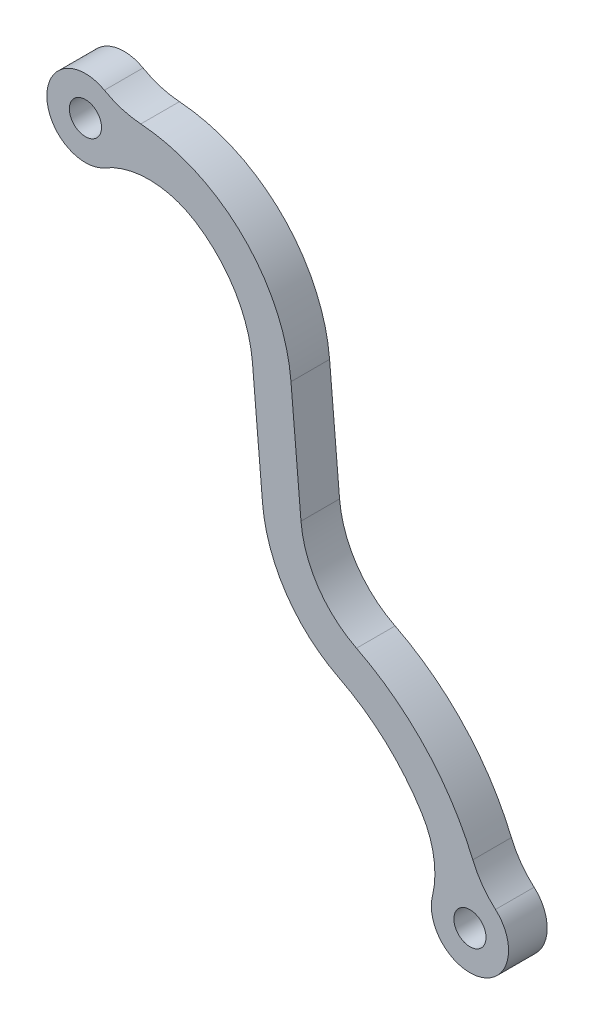
ISO-10303-21;
HEADER;
FILE_DESCRIPTION(('STEP AP214'),'2;1');
FILE_NAME('part.step','',(''),(''),'','','');
FILE_SCHEMA(('AUTOMOTIVE_DESIGN { 1 0 10303 214 1 1 1 1 }'));
ENDSEC;
DATA;
#1=APPLICATION_CONTEXT('core data for automotive mechanical design processes');
#2=APPLICATION_PROTOCOL_DEFINITION('international standard','automotive_design',2000,#1);
#3=PRODUCT_CONTEXT('',#1,'mechanical');
#4=PRODUCT('Part','Part','',(#3));
#5=PRODUCT_RELATED_PRODUCT_CATEGORY('part','',(#4));
#6=PRODUCT_DEFINITION_FORMATION('','',#4);
#7=PRODUCT_DEFINITION_CONTEXT('part definition',#1,'design');
#8=PRODUCT_DEFINITION('design','',#6,#7);
#9=PRODUCT_DEFINITION_SHAPE('','',#8);
#10=(LENGTH_UNIT() NAMED_UNIT(*) SI_UNIT(.MILLI.,.METRE.));
#11=(NAMED_UNIT(*) PLANE_ANGLE_UNIT() SI_UNIT($,.RADIAN.));
#12=(NAMED_UNIT(*) SI_UNIT($,.STERADIAN.) SOLID_ANGLE_UNIT());
#13=UNCERTAINTY_MEASURE_WITH_UNIT(LENGTH_MEASURE(1.E-05),#10,'distance_accuracy_value','');
#14=(GEOMETRIC_REPRESENTATION_CONTEXT(3) GLOBAL_UNCERTAINTY_ASSIGNED_CONTEXT((#13)) GLOBAL_UNIT_ASSIGNED_CONTEXT((#10,
#11,#12)) REPRESENTATION_CONTEXT('',''));
#15=CARTESIAN_POINT('',(0.,0.,0.));
#16=DIRECTION('',(0.,0.,1.));
#17=DIRECTION('',(1.,0.,0.));
#18=AXIS2_PLACEMENT_3D('',#15,#16,#17);
#19=CARTESIAN_POINT('',(-14.1622609382412,39.1593185727022,3.));
#20=DIRECTION('',(0.,0.,-1.));
#21=DIRECTION('',(0.,-1.,0.));
#22=AXIS2_PLACEMENT_3D('',#19,#20,#21);
#23=PLANE('',#22);
#24=CARTESIAN_POINT('',(5.33662649451798,1.75769314097142,3.));
#25=DIRECTION('',(0.,0.,-1.));
#26=DIRECTION('',(0.828839769918425,0.559486046118733,0.));
#27=AXIS2_PLACEMENT_3D('',#24,#25,#26);
#28=CIRCLE('',#27,1.25);
#29=CARTESIAN_POINT('',(4.30057678211995,1.05833558332301,3.));
#30=VERTEX_POINT('',#29);
#31=EDGE_CURVE('E292',#30,#30,#28,.T.);
#32=ORIENTED_EDGE('',*,*,#31,.T.);
#33=EDGE_LOOP('',(#32));
#34=FACE_BOUND('',#33,.T.);
#35=CARTESIAN_POINT('',(-24.5454457682828,41.336467874162,3.));
#36=DIRECTION('',(0.,0.,-1.));
#37=DIRECTION('',(0.828839769918425,0.559486046118733,0.));
#38=AXIS2_PLACEMENT_3D('',#35,#36,#37);
#39=CIRCLE('',#38,1.25);
#40=CARTESIAN_POINT('',(-25.5814954806809,40.6371103165135,3.));
#41=VERTEX_POINT('',#40);
#42=EDGE_CURVE('E284',#41,#41,#39,.T.);
#43=ORIENTED_EDGE('',*,*,#42,.T.);
#44=EDGE_LOOP('',(#43));
#45=FACE_BOUND('',#44,.T.);
#46=CARTESIAN_POINT('',(5.33662649451798,1.75769314097141,3.));
#47=DIRECTION('',(0.,0.,1.));
#48=DIRECTION('',(-0.99937181495664,-0.035439744218475,0.));
#49=AXIS2_PLACEMENT_3D('',#46,#47,#48);
#50=CIRCLE('',#49,3.);
#51=CARTESIAN_POINT('',(2.4214489745005,2.4660292383043,3.));
#52=VERTEX_POINT('',#51);
#53=CARTESIAN_POINT('',(7.32043155790682,4.00814142308608,3.));
#54=VERTEX_POINT('',#53);
#55=EDGE_CURVE('E304',#52,#54,#50,.T.);
#56=ORIENTED_EDGE('',*,*,#55,.T.);
#57=CARTESIAN_POINT('',(11.7839929505317,9.07165005784408,3.));
#58=DIRECTION('',(0.,0.,1.));
#59=DIRECTION('',(-0.8126091349157,-0.582809054366486,0.));
#60=AXIS2_PLACEMENT_3D('',#57,#58,#59);
#61=CIRCLE('',#60,6.75);
#62=CARTESIAN_POINT('',(5.55656068106256,6.4675019573754,3.));
#63=VERTEX_POINT('',#62);
#64=EDGE_CURVE('E246',#63,#54,#61,.T.);
#65=ORIENTED_EDGE('',*,*,#64,.F.);
#66=CARTESIAN_POINT('',(-12.169956282974,-0.945260395117725,3.));
#67=DIRECTION('',(0.,0.,1.));
#68=DIRECTION('',(0.988289825795073,0.152588401361126,0.));
#69=AXIS2_PLACEMENT_3D('',#66,#67,#68);
#70=CIRCLE('',#69,19.2140170024598);
#71=CARTESIAN_POINT('',(-3.48083762769424,16.1917657869619,3.));
#72=VERTEX_POINT('',#71);
#73=EDGE_CURVE('E10',#63,#72,#70,.T.);
#74=ORIENTED_EDGE('',*,*,#73,.T.);
#75=CARTESIAN_POINT('',(0.105872222532213,23.2656179288596,3.));
#76=DIRECTION('',(0.,0.,-1.));
#77=DIRECTION('',(0.996304557226185,0.0858907984031726,0.));
#78=AXIS2_PLACEMENT_3D('',#75,#76,#77);
#79=CIRCLE('',#78,7.93119610620883);
#80=CARTESIAN_POINT('',(-7.79601460233823,22.5844011630052,3.));
#81=VERTEX_POINT('',#80);
#82=EDGE_CURVE('E298',#72,#81,#79,.T.);
#83=ORIENTED_EDGE('',*,*,#82,.T.);
#84=DIRECTION('',(-0.0858907984031729,0.996304557226185,0.));
#85=VECTOR('',#84,1.);
#86=CARTESIAN_POINT('',(-7.79601460233823,22.5844011630052,3.));
#87=LINE('',#86,#85);
#88=CARTESIAN_POINT('',(-8.57206662738828,31.586345301103,3.));
#89=VERTEX_POINT('',#88);
#90=EDGE_CURVE('E234',#81,#89,#87,.T.);
#91=ORIENTED_EDGE('',*,*,#90,.T.);
#92=CARTESIAN_POINT('',(-21.1530693426858,30.50174485429,3.));
#93=DIRECTION('',(0.,0.,1.));
#94=DIRECTION('',(0.996304557226185,0.0858907984031727,0.));
#95=AXIS2_PLACEMENT_3D('',#92,#93,#94);
#96=CIRCLE('',#95,12.6276675380511);
#97=CARTESIAN_POINT('',(-20.2425861379913,43.0965456778647,3.));
#98=VERTEX_POINT('',#97);
#99=EDGE_CURVE('E235',#89,#98,#96,.T.);
#100=ORIENTED_EDGE('',*,*,#99,.T.);
#101=CARTESIAN_POINT('',(-19.7558959702965,49.8289770871454,3.));
#102=DIRECTION('',(0.,0.,1.));
#103=DIRECTION('',(-0.288669094892099,-0.957428928774443,0.));
#104=AXIS2_PLACEMENT_3D('',#101,#102,#103);
#105=CIRCLE('',#104,6.75);
#106=CARTESIAN_POINT('',(-23.0717381381332,43.949547632003,3.));
#107=VERTEX_POINT('',#106);
#108=EDGE_CURVE('E181',#107,#98,#105,.T.);
#109=ORIENTED_EDGE('',*,*,#108,.F.);
#110=CARTESIAN_POINT('',(-24.5454457682828,41.336467874162,3.));
#111=DIRECTION('',(0.,0.,1.));
#112=DIRECTION('',(-0.99937181495664,-0.035439744218475,0.));
#113=AXIS2_PLACEMENT_3D('',#110,#111,#112);
#114=CIRCLE('',#113,3.);
#115=CARTESIAN_POINT('',(-23.0261403740497,38.7496336856114,3.));
#116=VERTEX_POINT('',#115);
#117=EDGE_CURVE('E174',#107,#116,#114,.T.);
#118=ORIENTED_EDGE('',*,*,#117,.T.);
#119=CARTESIAN_POINT('',(-19.6077032370251,32.9292567613727,3.));
#120=DIRECTION('',(0.,0.,1.));
#121=DIRECTION('',(0.0179267686138765,0.999839302571701,0.));
#122=AXIS2_PLACEMENT_3D('',#119,#120,#121);
#123=CIRCLE('',#122,6.75);
#124=CARTESIAN_POINT('',(-15.9828156934577,38.6233493402205,3.));
#125=VERTEX_POINT('',#124);
#126=EDGE_CURVE('E179',#125,#116,#123,.T.);
#127=ORIENTED_EDGE('',*,*,#126,.F.);
#128=CARTESIAN_POINT('',(-21.1530693426858,30.50174485429,3.));
#129=DIRECTION('',(0.,0.,1.));
#130=DIRECTION('',(0.996304557226185,0.0858907984031727,0.));
#131=AXIS2_PLACEMENT_3D('',#128,#129,#130);
#132=CIRCLE('',#131,9.62766753805112);
#133=CARTESIAN_POINT('',(-11.5609802990668,31.3286729058935,3.));
#134=VERTEX_POINT('',#133);
#135=EDGE_CURVE('E288',#134,#125,#132,.T.);
#136=ORIENTED_EDGE('',*,*,#135,.F.);
#137=DIRECTION('',(-0.0858907984031729,0.996304557226185,0.));
#138=VECTOR('',#137,1.);
#139=CARTESIAN_POINT('',(-10.7849282740168,22.3267287677957,3.));
#140=LINE('',#139,#138);
#141=CARTESIAN_POINT('',(-10.7849282740168,22.3267287677957,3.));
#142=VERTEX_POINT('',#141);
#143=EDGE_CURVE('E266',#142,#134,#140,.T.);
#144=ORIENTED_EDGE('',*,*,#143,.F.);
#145=CARTESIAN_POINT('',(0.105872222532213,23.2656179288596,3.));
#146=DIRECTION('',(0.,0.,-1.));
#147=DIRECTION('',(0.996304557226185,0.0858907984031725,0.));
#148=AXIS2_PLACEMENT_3D('',#145,#146,#147);
#149=CIRCLE('',#148,10.9311961062088);
#150=CARTESIAN_POINT('',(-4.83752196717943,13.5160588517772,3.));
#151=VERTEX_POINT('',#150);
#152=EDGE_CURVE('E269',#151,#142,#149,.T.);
#153=ORIENTED_EDGE('',*,*,#152,.F.);
#154=CARTESIAN_POINT('',(-12.169956282974,-0.945260395117725,3.));
#155=DIRECTION('',(0.,0.,1.));
#156=DIRECTION('',(0.988289825795073,0.152588401361126,0.));
#157=AXIS2_PLACEMENT_3D('',#154,#155,#156);
#158=CIRCLE('',#157,16.2140170024598);
#159=CARTESIAN_POINT('',(1.59112769251247,7.62952328586605,3.));
#160=VERTEX_POINT('',#159);
#161=EDGE_CURVE('E265',#160,#151,#158,.T.);
#162=ORIENTED_EDGE('',*,*,#161,.F.);
#163=CARTESIAN_POINT('',(-4.13770044553881,4.05978545730329,3.));
#164=DIRECTION('',(0.,0.,1.));
#165=DIRECTION('',(0.987316167181108,0.158766451187921,0.));
#166=AXIS2_PLACEMENT_3D('',#163,#164,#165);
#167=CIRCLE('',#166,6.75);
#168=EDGE_CURVE('E18',#52,#160,#167,.T.);
#169=ORIENTED_EDGE('',*,*,#168,.F.);
#170=EDGE_LOOP('',(#56,#65,#74,#83,#91,#100,#109,#118,#127,#136,#144,#153,#162,#169));
#171=FACE_BOUND('',#170,.T.);
#172=ADVANCED_FACE('F15',(#34,#45,#171),#23,.F.);
#173=CARTESIAN_POINT('',(-12.169956282974,-0.945260395117725,0.));
#174=DIRECTION('',(0.,0.,1.));
#175=DIRECTION('',(0.988289825795073,0.152588401361126,0.));
#176=AXIS2_PLACEMENT_3D('',#173,#174,#175);
#177=CYLINDRICAL_SURFACE('',#176,19.2140170024598);
#178=DIRECTION('',(0.,0.,1.));
#179=VECTOR('',#178,1.);
#180=CARTESIAN_POINT('',(5.55656068106255,6.4675019573754,0.));
#181=LINE('',#180,#179);
#182=CARTESIAN_POINT('',(5.55656068106256,6.4675019573754,0.));
#183=VERTEX_POINT('',#182);
#184=EDGE_CURVE('E204',#183,#63,#181,.T.);
#185=ORIENTED_EDGE('',*,*,#184,.F.);
#186=CARTESIAN_POINT('',(-12.169956282974,-0.945260395117725,0.));
#187=DIRECTION('',(0.,0.,1.));
#188=DIRECTION('',(0.988289825795073,0.152588401361126,0.));
#189=AXIS2_PLACEMENT_3D('',#186,#187,#188);
#190=CIRCLE('',#189,19.2140170024598);
#191=CARTESIAN_POINT('',(-3.48083762769424,16.1917657869619,0.));
#192=VERTEX_POINT('',#191);
#193=EDGE_CURVE('E276',#183,#192,#190,.T.);
#194=ORIENTED_EDGE('',*,*,#193,.T.);
#195=DIRECTION('',(0.,0.,1.));
#196=VECTOR('',#195,1.);
#197=CARTESIAN_POINT('',(-3.48083762769424,16.1917657869619,0.));
#198=LINE('',#197,#196);
#199=EDGE_CURVE('E25',#192,#72,#198,.T.);
#200=ORIENTED_EDGE('',*,*,#199,.T.);
#201=ORIENTED_EDGE('',*,*,#73,.F.);
#202=EDGE_LOOP('',(#185,#194,#200,#201));
#203=FACE_BOUND('',#202,.T.);
#204=ADVANCED_FACE('F360',(#203),#177,.T.);
#205=CARTESIAN_POINT('',(0.105872222532213,23.2656179288596,0.));
#206=DIRECTION('',(0.,0.,1.));
#207=DIRECTION('',(0.996304557226185,0.0858907984031726,0.));
#208=AXIS2_PLACEMENT_3D('',#205,#206,#207);
#209=CYLINDRICAL_SURFACE('',#208,7.93119610620883);
#210=CARTESIAN_POINT('',(0.105872222532213,23.2656179288596,0.));
#211=DIRECTION('',(0.,0.,-1.));
#212=DIRECTION('',(0.996304557226185,0.0858907984031726,0.));
#213=AXIS2_PLACEMENT_3D('',#210,#211,#212);
#214=CIRCLE('',#213,7.93119610620883);
#215=CARTESIAN_POINT('',(-7.79601460233823,22.5844011630052,0.));
#216=VERTEX_POINT('',#215);
#217=EDGE_CURVE('E317',#192,#216,#214,.T.);
#218=ORIENTED_EDGE('',*,*,#217,.T.);
#219=DIRECTION('',(0.,0.,1.));
#220=VECTOR('',#219,1.);
#221=CARTESIAN_POINT('',(-7.79601460233823,22.5844011630052,0.));
#222=LINE('',#221,#220);
#223=EDGE_CURVE('E295',#216,#81,#222,.T.);
#224=ORIENTED_EDGE('',*,*,#223,.T.);
#225=ORIENTED_EDGE('',*,*,#82,.F.);
#226=ORIENTED_EDGE('',*,*,#199,.F.);
#227=EDGE_LOOP('',(#218,#224,#225,#226));
#228=FACE_BOUND('',#227,.T.);
#229=ADVANCED_FACE('F364',(#228),#209,.F.);
#230=CARTESIAN_POINT('',(-7.79601460233823,22.5844011630052,0.));
#231=DIRECTION('',(0.996304557226185,0.0858907984031729,0.));
#232=DIRECTION('',(0.,0.,-1.));
#233=AXIS2_PLACEMENT_3D('',#230,#231,#232);
#234=PLANE('',#233);
#235=DIRECTION('',(-0.0858907984031729,0.996304557226185,0.));
#236=VECTOR('',#235,1.);
#237=CARTESIAN_POINT('',(-7.79601460233823,22.5844011630052,0.));
#238=LINE('',#237,#236);
#239=CARTESIAN_POINT('',(-8.57206662738828,31.586345301103,0.));
#240=VERTEX_POINT('',#239);
#241=EDGE_CURVE('E249',#216,#240,#238,.T.);
#242=ORIENTED_EDGE('',*,*,#241,.T.);
#243=DIRECTION('',(0.,0.,1.));
#244=VECTOR('',#243,1.);
#245=CARTESIAN_POINT('',(-8.57206662738828,31.586345301103,0.));
#246=LINE('',#245,#244);
#247=EDGE_CURVE('E230',#240,#89,#246,.T.);
#248=ORIENTED_EDGE('',*,*,#247,.T.);
#249=ORIENTED_EDGE('',*,*,#90,.F.);
#250=ORIENTED_EDGE('',*,*,#223,.F.);
#251=EDGE_LOOP('',(#242,#248,#249,#250));
#252=FACE_BOUND('',#251,.T.);
#253=ADVANCED_FACE('F370',(#252),#234,.T.);
#254=CARTESIAN_POINT('',(-21.1530693426858,30.50174485429,0.));
#255=DIRECTION('',(0.,0.,1.));
#256=DIRECTION('',(0.996304557226185,0.0858907984031727,0.));
#257=AXIS2_PLACEMENT_3D('',#254,#255,#256);
#258=CYLINDRICAL_SURFACE('',#257,12.6276675380511);
#259=DIRECTION('',(0.,0.,-1.));
#260=VECTOR('',#259,1.);
#261=CARTESIAN_POINT('',(-20.2425861379913,43.0965456778647,0.));
#262=LINE('',#261,#260);
#263=CARTESIAN_POINT('',(-20.2425861379913,43.0965456778647,0.));
#264=VERTEX_POINT('',#263);
#265=EDGE_CURVE('E217',#98,#264,#262,.T.);
#266=ORIENTED_EDGE('',*,*,#265,.F.);
#267=ORIENTED_EDGE('',*,*,#99,.F.);
#268=ORIENTED_EDGE('',*,*,#247,.F.);
#269=CARTESIAN_POINT('',(-21.1530693426858,30.50174485429,0.));
#270=DIRECTION('',(0.,0.,1.));
#271=DIRECTION('',(0.996304557226185,0.0858907984031727,0.));
#272=AXIS2_PLACEMENT_3D('',#269,#270,#271);
#273=CIRCLE('',#272,12.6276675380511);
#274=EDGE_CURVE('E247',#240,#264,#273,.T.);
#275=ORIENTED_EDGE('',*,*,#274,.T.);
#276=EDGE_LOOP('',(#266,#267,#268,#275));
#277=FACE_BOUND('',#276,.T.);
#278=ADVANCED_FACE('F386',(#277),#258,.T.);
#279=CARTESIAN_POINT('',(0.105872222532213,23.2656179288596,0.));
#280=DIRECTION('',(0.,0.,1.));
#281=DIRECTION('',(0.996304557226185,0.0858907984031726,0.));
#282=AXIS2_PLACEMENT_3D('',#279,#280,#281);
#283=CYLINDRICAL_SURFACE('',#282,10.9311961062088);
#284=CARTESIAN_POINT('',(0.105872222532213,23.2656179288596,0.));
#285=DIRECTION('',(0.,0.,-1.));
#286=DIRECTION('',(0.996304557226185,0.0858907984031725,0.));
#287=AXIS2_PLACEMENT_3D('',#284,#285,#286);
#288=CIRCLE('',#287,10.9311961062088);
#289=CARTESIAN_POINT('',(-4.83752196717943,13.5160588517772,0.));
#290=VERTEX_POINT('',#289);
#291=CARTESIAN_POINT('',(-10.7849282740168,22.3267287677957,0.));
#292=VERTEX_POINT('',#291);
#293=EDGE_CURVE('E221',#290,#292,#288,.T.);
#294=ORIENTED_EDGE('',*,*,#293,.F.);
#295=DIRECTION('',(0.,0.,1.));
#296=VECTOR('',#295,1.);
#297=CARTESIAN_POINT('',(-4.83752196717943,13.5160588517772,0.));
#298=LINE('',#297,#296);
#299=EDGE_CURVE('E260',#290,#151,#298,.T.);
#300=ORIENTED_EDGE('',*,*,#299,.T.);
#301=ORIENTED_EDGE('',*,*,#152,.T.);
#302=DIRECTION('',(0.,0.,1.));
#303=VECTOR('',#302,1.);
#304=CARTESIAN_POINT('',(-10.7849282740168,22.3267287677957,0.));
#305=LINE('',#304,#303);
#306=EDGE_CURVE('E270',#292,#142,#305,.T.);
#307=ORIENTED_EDGE('',*,*,#306,.F.);
#308=EDGE_LOOP('',(#294,#300,#301,#307));
#309=FACE_BOUND('',#308,.T.);
#310=ADVANCED_FACE('F381',(#309),#283,.T.);
#311=CARTESIAN_POINT('',(-10.7849282740168,22.3267287677957,0.));
#312=DIRECTION('',(0.996304557226185,0.0858907984031729,0.));
#313=DIRECTION('',(0.,0.,-1.));
#314=AXIS2_PLACEMENT_3D('',#311,#312,#313);
#315=PLANE('',#314);
#316=DIRECTION('',(-0.0858907984031729,0.996304557226185,0.));
#317=VECTOR('',#316,1.);
#318=CARTESIAN_POINT('',(-10.7849282740168,22.3267287677957,0.));
#319=LINE('',#318,#317);
#320=CARTESIAN_POINT('',(-11.5609802990668,31.3286729058935,0.));
#321=VERTEX_POINT('',#320);
#322=EDGE_CURVE('E225',#292,#321,#319,.T.);
#323=ORIENTED_EDGE('',*,*,#322,.F.);
#324=ORIENTED_EDGE('',*,*,#306,.T.);
#325=ORIENTED_EDGE('',*,*,#143,.T.);
#326=DIRECTION('',(0.,0.,1.));
#327=VECTOR('',#326,1.);
#328=CARTESIAN_POINT('',(-11.5609802990668,31.3286729058935,0.));
#329=LINE('',#328,#327);
#330=EDGE_CURVE('E264',#321,#134,#329,.T.);
#331=ORIENTED_EDGE('',*,*,#330,.F.);
#332=EDGE_LOOP('',(#323,#324,#325,#331));
#333=FACE_BOUND('',#332,.T.);
#334=ADVANCED_FACE('F377',(#333),#315,.F.);
#335=CARTESIAN_POINT('',(-21.1530693426858,30.50174485429,0.));
#336=DIRECTION('',(0.,0.,1.));
#337=DIRECTION('',(0.996304557226185,0.0858907984031727,0.));
#338=AXIS2_PLACEMENT_3D('',#335,#336,#337);
#339=CYLINDRICAL_SURFACE('',#338,9.62766753805112);
#340=DIRECTION('',(0.,0.,1.));
#341=VECTOR('',#340,1.);
#342=CARTESIAN_POINT('',(-15.9828156934577,38.6233493402205,0.));
#343=LINE('',#342,#341);
#344=CARTESIAN_POINT('',(-15.9828156934577,38.6233493402205,0.));
#345=VERTEX_POINT('',#344);
#346=EDGE_CURVE('E187',#345,#125,#343,.T.);
#347=ORIENTED_EDGE('',*,*,#346,.F.);
#348=CARTESIAN_POINT('',(-21.1530693426858,30.50174485429,0.));
#349=DIRECTION('',(0.,0.,1.));
#350=DIRECTION('',(0.996304557226185,0.0858907984031727,0.));
#351=AXIS2_PLACEMENT_3D('',#348,#349,#350);
#352=CIRCLE('',#351,9.62766753805112);
#353=EDGE_CURVE('E250',#321,#345,#352,.T.);
#354=ORIENTED_EDGE('',*,*,#353,.F.);
#355=ORIENTED_EDGE('',*,*,#330,.T.);
#356=ORIENTED_EDGE('',*,*,#135,.T.);
#357=EDGE_LOOP('',(#347,#354,#355,#356));
#358=FACE_BOUND('',#357,.T.);
#359=ADVANCED_FACE('F380',(#358),#339,.F.);
#360=CARTESIAN_POINT('',(-12.169956282974,-0.945260395117725,0.));
#361=DIRECTION('',(0.,0.,1.));
#362=DIRECTION('',(0.988289825795073,0.152588401361126,0.));
#363=AXIS2_PLACEMENT_3D('',#360,#361,#362);
#364=CYLINDRICAL_SURFACE('',#363,16.2140170024598);
#365=DIRECTION('',(0.,0.,-1.));
#366=VECTOR('',#365,1.);
#367=CARTESIAN_POINT('',(1.59112769251247,7.62952328586605,0.));
#368=LINE('',#367,#366);
#369=CARTESIAN_POINT('',(1.59112769251247,7.62952328586605,0.));
#370=VERTEX_POINT('',#369);
#371=EDGE_CURVE('E405',#160,#370,#368,.T.);
#372=ORIENTED_EDGE('',*,*,#371,.F.);
#373=ORIENTED_EDGE('',*,*,#161,.T.);
#374=ORIENTED_EDGE('',*,*,#299,.F.);
#375=CARTESIAN_POINT('',(-12.169956282974,-0.945260395117725,0.));
#376=DIRECTION('',(0.,0.,1.));
#377=DIRECTION('',(0.988289825795073,0.152588401361126,0.));
#378=AXIS2_PLACEMENT_3D('',#375,#376,#377);
#379=CIRCLE('',#378,16.2140170024598);
#380=EDGE_CURVE('E125',#370,#290,#379,.T.);
#381=ORIENTED_EDGE('',*,*,#380,.F.);
#382=EDGE_LOOP('',(#372,#373,#374,#381));
#383=FACE_BOUND('',#382,.T.);
#384=ADVANCED_FACE('F392',(#383),#364,.F.);
#385=CARTESIAN_POINT('',(-14.1622609382412,39.1593185727022,0.));
#386=DIRECTION('',(0.,0.,1.));
#387=DIRECTION('',(1.,0.,0.));
#388=AXIS2_PLACEMENT_3D('',#385,#386,#387);
#389=PLANE('',#388);
#390=CARTESIAN_POINT('',(5.33662649451798,1.75769314097142,0.));
#391=DIRECTION('',(0.,0.,1.));
#392=DIRECTION('',(0.828839769918425,0.559486046118733,0.));
#393=AXIS2_PLACEMENT_3D('',#390,#391,#392);
#394=CIRCLE('',#393,1.25);
#395=CARTESIAN_POINT('',(4.30057678211995,1.05833558332301,0.));
#396=VERTEX_POINT('',#395);
#397=EDGE_CURVE('E136',#396,#396,#394,.T.);
#398=ORIENTED_EDGE('',*,*,#397,.T.);
#399=EDGE_LOOP('',(#398));
#400=FACE_BOUND('',#399,.T.);
#401=CARTESIAN_POINT('',(-24.5454457682828,41.336467874162,0.));
#402=DIRECTION('',(0.,0.,1.));
#403=DIRECTION('',(0.828839769918425,0.559486046118733,0.));
#404=AXIS2_PLACEMENT_3D('',#401,#402,#403);
#405=CIRCLE('',#404,1.25);
#406=CARTESIAN_POINT('',(-25.5814954806809,40.6371103165135,0.));
#407=VERTEX_POINT('',#406);
#408=EDGE_CURVE('E283',#407,#407,#405,.T.);
#409=ORIENTED_EDGE('',*,*,#408,.T.);
#410=EDGE_LOOP('',(#409));
#411=FACE_BOUND('',#410,.T.);
#412=ORIENTED_EDGE('',*,*,#380,.T.);
#413=ORIENTED_EDGE('',*,*,#293,.T.);
#414=ORIENTED_EDGE('',*,*,#322,.T.);
#415=ORIENTED_EDGE('',*,*,#353,.T.);
#416=CARTESIAN_POINT('',(-19.6077032370251,32.9292567613727,0.));
#417=DIRECTION('',(0.,0.,-1.));
#418=DIRECTION('',(0.0179267686138765,0.999839302571701,0.));
#419=AXIS2_PLACEMENT_3D('',#416,#417,#418);
#420=CIRCLE('',#419,6.75);
#421=CARTESIAN_POINT('',(-23.0261403740497,38.7496336856114,0.));
#422=VERTEX_POINT('',#421);
#423=EDGE_CURVE('E198',#422,#345,#420,.T.);
#424=ORIENTED_EDGE('',*,*,#423,.F.);
#425=CARTESIAN_POINT('',(-24.5454457682828,41.336467874162,0.));
#426=DIRECTION('',(0.,0.,1.));
#427=DIRECTION('',(-0.99937181495664,-0.035439744218475,0.));
#428=AXIS2_PLACEMENT_3D('',#425,#426,#427);
#429=CIRCLE('',#428,3.);
#430=CARTESIAN_POINT('',(-23.0717381381332,43.949547632003,0.));
#431=VERTEX_POINT('',#430);
#432=EDGE_CURVE('E193',#431,#422,#429,.T.);
#433=ORIENTED_EDGE('',*,*,#432,.F.);
#434=CARTESIAN_POINT('',(-19.7558959702965,49.8289770871454,0.));
#435=DIRECTION('',(0.,0.,-1.));
#436=DIRECTION('',(-0.288669094892099,-0.957428928774443,0.));
#437=AXIS2_PLACEMENT_3D('',#434,#435,#436);
#438=CIRCLE('',#437,6.75);
#439=EDGE_CURVE('E215',#264,#431,#438,.T.);
#440=ORIENTED_EDGE('',*,*,#439,.F.);
#441=ORIENTED_EDGE('',*,*,#274,.F.);
#442=ORIENTED_EDGE('',*,*,#241,.F.);
#443=ORIENTED_EDGE('',*,*,#217,.F.);
#444=ORIENTED_EDGE('',*,*,#193,.F.);
#445=CARTESIAN_POINT('',(11.7839929505317,9.07165005784408,0.));
#446=DIRECTION('',(0.,0.,-1.));
#447=DIRECTION('',(-0.8126091349157,-0.582809054366486,0.));
#448=AXIS2_PLACEMENT_3D('',#445,#446,#447);
#449=CIRCLE('',#448,6.75);
#450=CARTESIAN_POINT('',(7.32043155790682,4.00814142308608,0.));
#451=VERTEX_POINT('',#450);
#452=EDGE_CURVE('E211',#451,#183,#449,.T.);
#453=ORIENTED_EDGE('',*,*,#452,.F.);
#454=CARTESIAN_POINT('',(5.33662649451798,1.75769314097141,0.));
#455=DIRECTION('',(0.,0.,1.));
#456=DIRECTION('',(-0.99937181495664,-0.035439744218475,0.));
#457=AXIS2_PLACEMENT_3D('',#454,#455,#456);
#458=CIRCLE('',#457,3.);
#459=CARTESIAN_POINT('',(2.4214489745005,2.4660292383043,0.));
#460=VERTEX_POINT('',#459);
#461=EDGE_CURVE('E112',#460,#451,#458,.T.);
#462=ORIENTED_EDGE('',*,*,#461,.F.);
#463=CARTESIAN_POINT('',(-4.13770044553881,4.05978545730329,0.));
#464=DIRECTION('',(0.,0.,-1.));
#465=DIRECTION('',(0.987316167181108,0.158766451187921,0.));
#466=AXIS2_PLACEMENT_3D('',#463,#464,#465);
#467=CIRCLE('',#466,6.75);
#468=EDGE_CURVE('E242',#370,#460,#467,.T.);
#469=ORIENTED_EDGE('',*,*,#468,.F.);
#470=EDGE_LOOP('',(#412,#413,#414,#415,#424,#433,#440,#441,#442,#443,#444,#453,#462,#469));
#471=FACE_BOUND('',#470,.T.);
#472=ADVANCED_FACE('F389',(#400,#411,#471),#389,.F.);
#473=CARTESIAN_POINT('',(-19.7558959702965,49.8289770871454,0.));
#474=DIRECTION('',(0.,0.,1.));
#475=DIRECTION('',(-0.288669094892099,-0.957428928774443,0.));
#476=AXIS2_PLACEMENT_3D('',#473,#474,#475);
#477=CYLINDRICAL_SURFACE('',#476,6.75);
#478=ORIENTED_EDGE('',*,*,#439,.T.);
#479=DIRECTION('',(0.,0.,1.));
#480=VECTOR('',#479,1.);
#481=CARTESIAN_POINT('',(-23.0717381381332,43.949547632003,0.));
#482=LINE('',#481,#480);
#483=EDGE_CURVE('E186',#431,#107,#482,.T.);
#484=ORIENTED_EDGE('',*,*,#483,.T.);
#485=ORIENTED_EDGE('',*,*,#108,.T.);
#486=ORIENTED_EDGE('',*,*,#265,.T.);
#487=EDGE_LOOP('',(#478,#484,#485,#486));
#488=FACE_BOUND('',#487,.T.);
#489=ADVANCED_FACE('F391',(#488),#477,.F.);
#490=CARTESIAN_POINT('',(-24.5454457682828,41.336467874162,0.));
#491=DIRECTION('',(0.,0.,1.));
#492=DIRECTION('',(-0.99937181495664,-0.035439744218475,0.));
#493=AXIS2_PLACEMENT_3D('',#490,#491,#492);
#494=CYLINDRICAL_SURFACE('',#493,3.);
#495=DIRECTION('',(0.,0.,-1.));
#496=VECTOR('',#495,1.);
#497=CARTESIAN_POINT('',(-23.0261403740497,38.7496336856114,0.));
#498=LINE('',#497,#496);
#499=EDGE_CURVE('E190',#116,#422,#498,.T.);
#500=ORIENTED_EDGE('',*,*,#499,.F.);
#501=ORIENTED_EDGE('',*,*,#117,.F.);
#502=ORIENTED_EDGE('',*,*,#483,.F.);
#503=ORIENTED_EDGE('',*,*,#432,.T.);
#504=EDGE_LOOP('',(#500,#501,#502,#503));
#505=FACE_BOUND('',#504,.T.);
#506=ADVANCED_FACE('F191',(#505),#494,.T.);
#507=CARTESIAN_POINT('',(-19.6077032370251,32.9292567613727,0.));
#508=DIRECTION('',(0.,0.,-1.));
#509=DIRECTION('',(0.0179267686138765,0.999839302571701,0.));
#510=AXIS2_PLACEMENT_3D('',#507,#508,#509);
#511=CYLINDRICAL_SURFACE('',#510,6.75);
#512=ORIENTED_EDGE('',*,*,#126,.T.);
#513=ORIENTED_EDGE('',*,*,#499,.T.);
#514=ORIENTED_EDGE('',*,*,#423,.T.);
#515=ORIENTED_EDGE('',*,*,#346,.T.);
#516=EDGE_LOOP('',(#512,#513,#514,#515));
#517=FACE_BOUND('',#516,.T.);
#518=ADVANCED_FACE('F201',(#517),#511,.F.);
#519=CARTESIAN_POINT('',(11.7839929505317,9.07165005784408,0.));
#520=DIRECTION('',(0.,0.,-1.));
#521=DIRECTION('',(-0.8126091349157,-0.582809054366486,0.));
#522=AXIS2_PLACEMENT_3D('',#519,#520,#521);
#523=CYLINDRICAL_SURFACE('',#522,6.75);
#524=ORIENTED_EDGE('',*,*,#64,.T.);
#525=DIRECTION('',(0.,0.,-1.));
#526=VECTOR('',#525,1.);
#527=CARTESIAN_POINT('',(7.32043155790682,4.00814142308608,0.));
#528=LINE('',#527,#526);
#529=EDGE_CURVE('E307',#54,#451,#528,.T.);
#530=ORIENTED_EDGE('',*,*,#529,.T.);
#531=ORIENTED_EDGE('',*,*,#452,.T.);
#532=ORIENTED_EDGE('',*,*,#184,.T.);
#533=EDGE_LOOP('',(#524,#530,#531,#532));
#534=FACE_BOUND('',#533,.T.);
#535=ADVANCED_FACE('F376',(#534),#523,.F.);
#536=CARTESIAN_POINT('',(5.33662649451798,1.75769314097141,0.));
#537=DIRECTION('',(0.,0.,1.));
#538=DIRECTION('',(0.300257511859908,-0.95385817948566,0.));
#539=AXIS2_PLACEMENT_3D('',#536,#537,#538);
#540=CYLINDRICAL_SURFACE('',#539,3.);
#541=DIRECTION('',(0.,0.,1.));
#542=VECTOR('',#541,1.);
#543=CARTESIAN_POINT('',(2.4214489745005,2.4660292383043,0.));
#544=LINE('',#543,#542);
#545=EDGE_CURVE('E238',#460,#52,#544,.T.);
#546=ORIENTED_EDGE('',*,*,#545,.F.);
#547=ORIENTED_EDGE('',*,*,#461,.T.);
#548=ORIENTED_EDGE('',*,*,#529,.F.);
#549=ORIENTED_EDGE('',*,*,#55,.F.);
#550=EDGE_LOOP('',(#546,#547,#548,#549));
#551=FACE_BOUND('',#550,.T.);
#552=ADVANCED_FACE('F354',(#551),#540,.T.);
#553=CARTESIAN_POINT('',(-4.13770044553881,4.05978545730329,0.));
#554=DIRECTION('',(0.,0.,1.));
#555=DIRECTION('',(0.987316167181108,0.158766451187921,0.));
#556=AXIS2_PLACEMENT_3D('',#553,#554,#555);
#557=CYLINDRICAL_SURFACE('',#556,6.75);
#558=ORIENTED_EDGE('',*,*,#468,.T.);
#559=ORIENTED_EDGE('',*,*,#545,.T.);
#560=ORIENTED_EDGE('',*,*,#168,.T.);
#561=ORIENTED_EDGE('',*,*,#371,.T.);
#562=EDGE_LOOP('',(#558,#559,#560,#561));
#563=FACE_BOUND('',#562,.T.);
#564=ADVANCED_FACE('F345',(#563),#557,.F.);
#565=CARTESIAN_POINT('',(5.33662649451798,1.75769314097142,-37.875));
#566=DIRECTION('',(0.,0.,1.));
#567=DIRECTION('',(0.828839769918425,0.559486046118733,0.));
#568=AXIS2_PLACEMENT_3D('',#565,#566,#567);
#569=CYLINDRICAL_SURFACE('',#568,1.25);
#570=ORIENTED_EDGE('',*,*,#31,.F.);
#571=DIRECTION('',(0.,0.,-1.));
#572=VECTOR('',#571,1.);
#573=CARTESIAN_POINT('',(4.30057678211995,1.05833558332301,-37.875));
#574=LINE('',#573,#572);
#575=EDGE_CURVE('E253',#30,#396,#574,.T.);
#576=ORIENTED_EDGE('',*,*,#575,.T.);
#577=ORIENTED_EDGE('',*,*,#397,.F.);
#578=ORIENTED_EDGE('',*,*,#575,.F.);
#579=EDGE_LOOP('',(#570,#576,#577,#578));
#580=FACE_BOUND('',#579,.T.);
#581=ADVANCED_FACE('F342',(#580),#569,.F.);
#582=CARTESIAN_POINT('',(-24.5454457682828,41.336467874162,-37.875));
#583=DIRECTION('',(0.,0.,1.));
#584=DIRECTION('',(0.828839769918425,0.559486046118733,0.));
#585=AXIS2_PLACEMENT_3D('',#582,#583,#584);
#586=CYLINDRICAL_SURFACE('',#585,1.25);
#587=ORIENTED_EDGE('',*,*,#42,.F.);
#588=DIRECTION('',(0.,0.,-1.));
#589=VECTOR('',#588,1.);
#590=CARTESIAN_POINT('',(-25.5814954806809,40.6371103165135,-37.875));
#591=LINE('',#590,#589);
#592=EDGE_CURVE('E279',#41,#407,#591,.T.);
#593=ORIENTED_EDGE('',*,*,#592,.T.);
#594=ORIENTED_EDGE('',*,*,#408,.F.);
#595=ORIENTED_EDGE('',*,*,#592,.F.);
#596=EDGE_LOOP('',(#587,#593,#594,#595));
#597=FACE_BOUND('',#596,.T.);
#598=ADVANCED_FACE('F344',(#597),#586,.F.);
#599=CLOSED_SHELL('',(#172,#204,#229,#253,#278,#310,#334,#359,#384,#472,#489,#506,#518,#535,
#552,#564,#581,#598));
#600=MANIFOLD_SOLID_BREP('B1',#599);
#601=ADVANCED_BREP_SHAPE_REPRESENTATION('',(#18,#600),#14);
#602=SHAPE_DEFINITION_REPRESENTATION(#9,#601);
ENDSEC;
END-ISO-10303-21;
